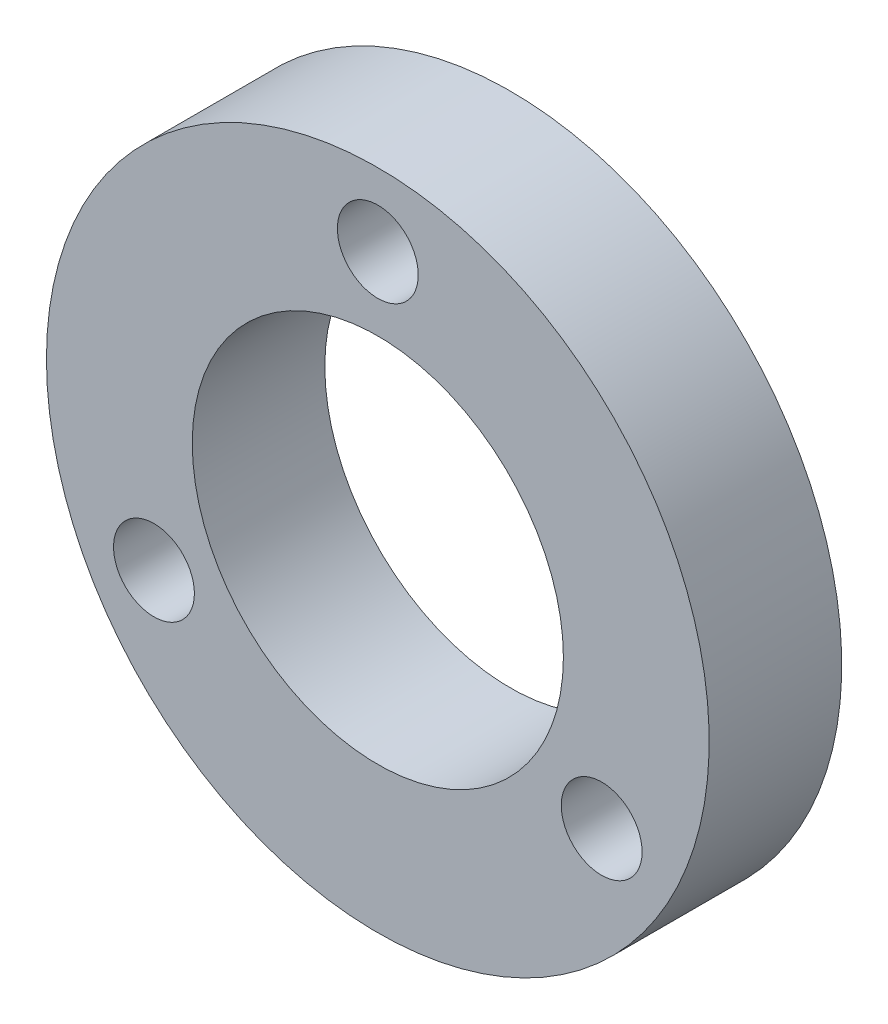
ISO-10303-21;
HEADER;
FILE_DESCRIPTION(('STEP AP214'),'2;1');
FILE_NAME('part.step','',(''),(''),'','','');
FILE_SCHEMA(('AUTOMOTIVE_DESIGN { 1 0 10303 214 1 1 1 1 }'));
ENDSEC;
DATA;
#1=APPLICATION_CONTEXT('core data for automotive mechanical design processes');
#2=APPLICATION_PROTOCOL_DEFINITION('international standard','automotive_design',2000,#1);
#3=PRODUCT_CONTEXT('',#1,'mechanical');
#4=PRODUCT('Part','Part','',(#3));
#5=PRODUCT_RELATED_PRODUCT_CATEGORY('part','',(#4));
#6=PRODUCT_DEFINITION_FORMATION('','',#4);
#7=PRODUCT_DEFINITION_CONTEXT('part definition',#1,'design');
#8=PRODUCT_DEFINITION('design','',#6,#7);
#9=PRODUCT_DEFINITION_SHAPE('','',#8);
#10=(LENGTH_UNIT() NAMED_UNIT(*) SI_UNIT(.MILLI.,.METRE.));
#11=(NAMED_UNIT(*) PLANE_ANGLE_UNIT() SI_UNIT($,.RADIAN.));
#12=(NAMED_UNIT(*) SI_UNIT($,.STERADIAN.) SOLID_ANGLE_UNIT());
#13=UNCERTAINTY_MEASURE_WITH_UNIT(LENGTH_MEASURE(1.E-05),#10,'distance_accuracy_value','');
#14=(GEOMETRIC_REPRESENTATION_CONTEXT(3) GLOBAL_UNCERTAINTY_ASSIGNED_CONTEXT((#13)) GLOBAL_UNIT_ASSIGNED_CONTEXT((#10,
#11,#12)) REPRESENTATION_CONTEXT('',''));
#15=CARTESIAN_POINT('',(0.,0.,0.));
#16=DIRECTION('',(0.,0.,1.));
#17=DIRECTION('',(1.,0.,0.));
#18=AXIS2_PLACEMENT_3D('',#15,#16,#17);
#19=CARTESIAN_POINT('',(0.,0.,5.));
#20=DIRECTION('',(0.,0.,0.999999999999999));
#21=DIRECTION('',(1.,0.,0.));
#22=AXIS2_PLACEMENT_3D('',#19,#20,#21);
#23=PLANE('',#22);
#24=CARTESIAN_POINT('',(0.,9.74999999999993,5.));
#25=DIRECTION('',(0.,0.,0.999999999999999));
#26=DIRECTION('',(1.,0.,0.));
#27=AXIS2_PLACEMENT_3D('',#24,#25,#26);
#28=CIRCLE('',#27,1.525);
#29=CARTESIAN_POINT('',(1.52500000000011,9.74999999999993,5.00000000000001));
#30=VERTEX_POINT('',#29);
#31=EDGE_CURVE('E59',#30,#30,#28,.T.);
#32=ORIENTED_EDGE('',*,*,#31,.F.);
#33=EDGE_LOOP('',(#32));
#34=FACE_BOUND('',#33,.T.);
#35=CARTESIAN_POINT('',(8.44374768689865,-4.87499999999986,5.00000000000012));
#36=DIRECTION('',(0.,0.,0.999999999999999));
#37=DIRECTION('',(1.,0.,0.));
#38=AXIS2_PLACEMENT_3D('',#35,#36,#37);
#39=CIRCLE('',#38,1.52500000000053);
#40=CARTESIAN_POINT('',(9.9687476868993,-4.87499999999985,5.00000000000012));
#41=VERTEX_POINT('',#40);
#42=EDGE_CURVE('E52',#41,#41,#39,.T.);
#43=ORIENTED_EDGE('',*,*,#42,.F.);
#44=EDGE_LOOP('',(#43));
#45=FACE_BOUND('',#44,.T.);
#46=CARTESIAN_POINT('',(-8.44374768689776,-4.8750000000004,5.00000000000006));
#47=DIRECTION('',(0.,0.,0.999999999999999));
#48=DIRECTION('',(1.,0.,0.));
#49=AXIS2_PLACEMENT_3D('',#46,#47,#48);
#50=CIRCLE('',#49,1.52500000000079);
#51=CARTESIAN_POINT('',(-6.91874768689692,-4.87500000000041,5.00000000000006));
#52=VERTEX_POINT('',#51);
#53=EDGE_CURVE('E53',#52,#52,#50,.T.);
#54=ORIENTED_EDGE('',*,*,#53,.F.);
#55=EDGE_LOOP('',(#54));
#56=FACE_BOUND('',#55,.T.);
#57=CARTESIAN_POINT('',(0.,0.,5.));
#58=DIRECTION('',(0.,0.,0.999999999999999));
#59=DIRECTION('',(1.,0.,0.));
#60=AXIS2_PLACEMENT_3D('',#57,#58,#59);
#61=CIRCLE('',#60,12.5);
#62=CARTESIAN_POINT('',(-12.5,0.,5.));
#63=VERTEX_POINT('',#62);
#64=EDGE_CURVE('E10',#63,#63,#61,.T.);
#65=ORIENTED_EDGE('',*,*,#64,.T.);
#66=EDGE_LOOP('',(#65));
#67=FACE_BOUND('',#66,.T.);
#68=CARTESIAN_POINT('',(0.,0.,5.));
#69=DIRECTION('',(0.,0.,0.999999999999999));
#70=DIRECTION('',(1.,0.,0.));
#71=AXIS2_PLACEMENT_3D('',#68,#69,#70);
#72=CIRCLE('',#71,7.);
#73=CARTESIAN_POINT('',(-7.00000000000001,0.,5.));
#74=VERTEX_POINT('',#73);
#75=EDGE_CURVE('E41',#74,#74,#72,.T.);
#76=ORIENTED_EDGE('',*,*,#75,.F.);
#77=EDGE_LOOP('',(#76));
#78=FACE_BOUND('',#77,.T.);
#79=ADVANCED_FACE('F30',(#34,#45,#56,#67,#78),#23,.T.);
#80=CARTESIAN_POINT('',(0.,0.,0.));
#81=DIRECTION('',(0.,0.,0.999999999999999));
#82=DIRECTION('',(1.,0.,0.));
#83=AXIS2_PLACEMENT_3D('',#80,#81,#82);
#84=PLANE('',#83);
#85=CARTESIAN_POINT('',(1.11022302462516E-13,9.74999999999993,0.));
#86=DIRECTION('',(0.,0.,0.999999999999999));
#87=DIRECTION('',(1.,0.,0.));
#88=AXIS2_PLACEMENT_3D('',#85,#86,#87);
#89=CIRCLE('',#88,1.525);
#90=CARTESIAN_POINT('',(1.52500000000011,9.74999999999993,0.));
#91=VERTEX_POINT('',#90);
#92=EDGE_CURVE('E46',#91,#91,#89,.F.);
#93=ORIENTED_EDGE('',*,*,#92,.F.);
#94=EDGE_LOOP('',(#93));
#95=FACE_BOUND('',#94,.T.);
#96=CARTESIAN_POINT('',(8.44374768689876,-4.87499999999985,1.11022302462516E-13));
#97=DIRECTION('',(0.,0.,0.999999999999999));
#98=DIRECTION('',(1.,0.,0.));
#99=AXIS2_PLACEMENT_3D('',#96,#97,#98);
#100=CIRCLE('',#99,1.52500000000053);
#101=CARTESIAN_POINT('',(9.9687476868993,-4.87499999999985,1.11022302462516E-13));
#102=VERTEX_POINT('',#101);
#103=EDGE_CURVE('E56',#102,#102,#100,.F.);
#104=ORIENTED_EDGE('',*,*,#103,.F.);
#105=EDGE_LOOP('',(#104));
#106=FACE_BOUND('',#105,.T.);
#107=CARTESIAN_POINT('',(-8.44374768689771,-4.87500000000041,1.11022302462516E-13));
#108=DIRECTION('',(0.,0.,0.999999999999999));
#109=DIRECTION('',(1.,0.,0.));
#110=AXIS2_PLACEMENT_3D('',#107,#108,#109);
#111=CIRCLE('',#110,1.52500000000079);
#112=CARTESIAN_POINT('',(-6.91874768689692,-4.87500000000041,1.11022302462516E-13));
#113=VERTEX_POINT('',#112);
#114=EDGE_CURVE('E49',#113,#113,#111,.F.);
#115=ORIENTED_EDGE('',*,*,#114,.F.);
#116=EDGE_LOOP('',(#115));
#117=FACE_BOUND('',#116,.T.);
#118=CARTESIAN_POINT('',(0.,0.,0.));
#119=DIRECTION('',(0.,0.,0.999999999999999));
#120=DIRECTION('',(1.,0.,0.));
#121=AXIS2_PLACEMENT_3D('',#118,#119,#120);
#122=CIRCLE('',#121,12.5);
#123=CARTESIAN_POINT('',(-12.5,0.,0.));
#124=VERTEX_POINT('',#123);
#125=EDGE_CURVE('E34',#124,#124,#122,.T.);
#126=ORIENTED_EDGE('',*,*,#125,.F.);
#127=EDGE_LOOP('',(#126));
#128=FACE_BOUND('',#127,.T.);
#129=CARTESIAN_POINT('',(0.,0.,0.));
#130=DIRECTION('',(0.,0.,0.999999999999999));
#131=DIRECTION('',(1.,0.,0.));
#132=AXIS2_PLACEMENT_3D('',#129,#130,#131);
#133=CIRCLE('',#132,7.);
#134=CARTESIAN_POINT('',(-7.00000000000001,0.,0.));
#135=VERTEX_POINT('',#134);
#136=EDGE_CURVE('E43',#135,#135,#133,.T.);
#137=ORIENTED_EDGE('',*,*,#136,.T.);
#138=EDGE_LOOP('',(#137));
#139=FACE_BOUND('',#138,.T.);
#140=ADVANCED_FACE('F72',(#95,#106,#117,#128,#139),#84,.F.);
#141=CARTESIAN_POINT('',(0.,0.,5.));
#142=DIRECTION('',(0.,0.,-0.999999999999999));
#143=DIRECTION('',(-1.,0.,0.));
#144=AXIS2_PLACEMENT_3D('',#141,#142,#143);
#145=CYLINDRICAL_SURFACE('',#144,12.5);
#146=CARTESIAN_POINT('',(-12.5,0.,5.));
#147=CARTESIAN_POINT('',(-12.5,0.,4.94791666666667));
#148=CARTESIAN_POINT('',(-12.5,0.,4.89583333333334));
#149=CARTESIAN_POINT('',(-12.5,0.,4.79166666666667));
#150=CARTESIAN_POINT('',(-12.5,0.,4.73958333333334));
#151=CARTESIAN_POINT('',(-12.5,0.,4.63541666666667));
#152=CARTESIAN_POINT('',(-12.5,0.,4.58333333333334));
#153=CARTESIAN_POINT('',(-12.5,0.,4.47916666666667));
#154=CARTESIAN_POINT('',(-12.5,0.,4.42708333333334));
#155=CARTESIAN_POINT('',(-12.5,0.,4.32291666666667));
#156=CARTESIAN_POINT('',(-12.5,0.,4.27083333333334));
#157=CARTESIAN_POINT('',(-12.5,0.,4.16666666666667));
#158=CARTESIAN_POINT('',(-12.5,0.,4.11458333333334));
#159=CARTESIAN_POINT('',(-12.5,0.,4.01041666666667));
#160=CARTESIAN_POINT('',(-12.5,0.,3.95833333333334));
#161=CARTESIAN_POINT('',(-12.5,0.,3.85416666666667));
#162=CARTESIAN_POINT('',(-12.5,0.,3.80208333333334));
#163=CARTESIAN_POINT('',(-12.5,0.,3.69791666666667));
#164=CARTESIAN_POINT('',(-12.5,0.,3.64583333333334));
#165=CARTESIAN_POINT('',(-12.5,0.,3.54166666666667));
#166=CARTESIAN_POINT('',(-12.5,0.,3.48958333333334));
#167=CARTESIAN_POINT('',(-12.5,0.,3.38541666666667));
#168=CARTESIAN_POINT('',(-12.5,0.,3.33333333333334));
#169=CARTESIAN_POINT('',(-12.5,0.,3.22916666666667));
#170=CARTESIAN_POINT('',(-12.5,0.,3.17708333333334));
#171=CARTESIAN_POINT('',(-12.5,0.,3.07291666666667));
#172=CARTESIAN_POINT('',(-12.5,0.,3.02083333333333));
#173=CARTESIAN_POINT('',(-12.5,0.,2.91666666666667));
#174=CARTESIAN_POINT('',(-12.5,0.,2.86458333333333));
#175=CARTESIAN_POINT('',(-12.5,0.,2.76041666666667));
#176=CARTESIAN_POINT('',(-12.5,0.,2.70833333333333));
#177=CARTESIAN_POINT('',(-12.5,0.,2.60416666666667));
#178=CARTESIAN_POINT('',(-12.5,0.,2.55208333333333));
#179=CARTESIAN_POINT('',(-12.5,0.,2.44791666666667));
#180=CARTESIAN_POINT('',(-12.5,0.,2.39583333333333));
#181=CARTESIAN_POINT('',(-12.5,0.,2.29166666666667));
#182=CARTESIAN_POINT('',(-12.5,0.,2.23958333333333));
#183=CARTESIAN_POINT('',(-12.5,0.,2.13541666666667));
#184=CARTESIAN_POINT('',(-12.5,0.,2.08333333333333));
#185=CARTESIAN_POINT('',(-12.5,0.,1.97916666666667));
#186=CARTESIAN_POINT('',(-12.5,0.,1.92708333333333));
#187=CARTESIAN_POINT('',(-12.5,0.,1.82291666666667));
#188=CARTESIAN_POINT('',(-12.5,0.,1.77083333333333));
#189=CARTESIAN_POINT('',(-12.5,0.,1.66666666666667));
#190=CARTESIAN_POINT('',(-12.5,0.,1.61458333333333));
#191=CARTESIAN_POINT('',(-12.5,0.,1.51041666666667));
#192=CARTESIAN_POINT('',(-12.5,0.,1.45833333333333));
#193=CARTESIAN_POINT('',(-12.5,0.,1.35416666666667));
#194=CARTESIAN_POINT('',(-12.5,0.,1.30208333333333));
#195=CARTESIAN_POINT('',(-12.5,0.,1.19791666666667));
#196=CARTESIAN_POINT('',(-12.5,0.,1.14583333333333));
#197=CARTESIAN_POINT('',(-12.5,0.,1.04166666666667));
#198=CARTESIAN_POINT('',(-12.5,0.,0.989583333333333));
#199=CARTESIAN_POINT('',(-12.5,0.,0.885416666666667));
#200=CARTESIAN_POINT('',(-12.5,0.,0.833333333333333));
#201=CARTESIAN_POINT('',(-12.5,0.,0.729166666666667));
#202=CARTESIAN_POINT('',(-12.5,0.,0.677083333333333));
#203=CARTESIAN_POINT('',(-12.5,0.,0.572916666666667));
#204=CARTESIAN_POINT('',(-12.5,0.,0.520833333333334));
#205=CARTESIAN_POINT('',(-12.5,0.,0.416666666666667));
#206=CARTESIAN_POINT('',(-12.5,0.,0.364583333333333));
#207=CARTESIAN_POINT('',(-12.5,0.,0.260416666666666));
#208=CARTESIAN_POINT('',(-12.5,0.,0.208333333333333));
#209=CARTESIAN_POINT('',(-12.5,0.,0.104166666666666));
#210=CARTESIAN_POINT('',(-12.5,0.,0.0520833333333324));
#211=CARTESIAN_POINT('',(-12.5,0.,0.));
#212=B_SPLINE_CURVE_WITH_KNOTS('',3,(#146,#147,#148,#149,#150,#151,#152,#153,#154,#155,#156,
#157,#158,#159,#160,#161,#162,#163,#164,#165,#166,#167,#168,#169,#170,#171,#172,#173,#174,#175,
#176,#177,#178,#179,#180,#181,#182,#183,#184,#185,#186,#187,#188,#189,#190,#191,#192,#193,#194,
#195,#196,#197,#198,#199,#200,#201,#202,#203,#204,#205,#206,#207,#208,#209,#210,#211),
.UNSPECIFIED.,.F.,.F.,(4,2,2,2,2,2,2,2,2,2,2,2,2,2,2,2,2,2,2,2,2,2,2,2,2,2,2,2,2,2,2,2,4),(0.,
0.156250000000001,0.312500000000001,0.468750000000001,0.625000000000001,0.781250000000002,
0.937500000000002,1.09375,1.25,1.40625,1.5625,1.71875,1.875,2.03125,2.1875,2.34375,2.5,2.65625,
2.8125,2.96875,3.125,3.28125,3.4375,3.59375,3.75,3.90625,4.0625,4.21875,4.375,4.53125,
4.68750000000001,4.84375000000001,5.00000000000001),.UNSPECIFIED.);
#213=EDGE_CURVE('BSEAM32',#63,#124,#212,.T.);
#214=ORIENTED_EDGE('',*,*,#64,.F.);
#215=ORIENTED_EDGE('',*,*,#125,.T.);
#216=ORIENTED_EDGE('',*,*,#213,.T.);
#217=ORIENTED_EDGE('',*,*,#213,.F.);
#218=EDGE_LOOP('',(#214,#216,#215,#217));
#219=FACE_BOUND('',#218,.T.);
#220=ADVANCED_FACE('F32',(#219),#145,.T.);
#221=CARTESIAN_POINT('',(0.,0.,5.));
#222=DIRECTION('',(0.,0.,-0.999999999999999));
#223=DIRECTION('',(-1.,0.,0.));
#224=AXIS2_PLACEMENT_3D('',#221,#222,#223);
#225=CYLINDRICAL_SURFACE('',#224,7.);
#226=CARTESIAN_POINT('',(-7.00000000000001,0.,5.));
#227=CARTESIAN_POINT('',(-7.00000000000001,0.,4.94791666666667));
#228=CARTESIAN_POINT('',(-7.00000000000001,0.,4.89583333333334));
#229=CARTESIAN_POINT('',(-7.00000000000001,0.,4.79166666666667));
#230=CARTESIAN_POINT('',(-7.00000000000001,0.,4.73958333333334));
#231=CARTESIAN_POINT('',(-7.00000000000001,0.,4.63541666666667));
#232=CARTESIAN_POINT('',(-7.00000000000001,0.,4.58333333333334));
#233=CARTESIAN_POINT('',(-7.00000000000001,0.,4.47916666666667));
#234=CARTESIAN_POINT('',(-7.00000000000001,0.,4.42708333333334));
#235=CARTESIAN_POINT('',(-7.00000000000001,0.,4.32291666666667));
#236=CARTESIAN_POINT('',(-7.00000000000001,0.,4.27083333333334));
#237=CARTESIAN_POINT('',(-7.00000000000001,0.,4.16666666666667));
#238=CARTESIAN_POINT('',(-7.00000000000001,0.,4.11458333333334));
#239=CARTESIAN_POINT('',(-7.00000000000001,0.,4.01041666666667));
#240=CARTESIAN_POINT('',(-7.00000000000001,0.,3.95833333333334));
#241=CARTESIAN_POINT('',(-7.00000000000001,0.,3.85416666666667));
#242=CARTESIAN_POINT('',(-7.00000000000001,0.,3.80208333333334));
#243=CARTESIAN_POINT('',(-7.00000000000001,0.,3.69791666666667));
#244=CARTESIAN_POINT('',(-7.00000000000001,0.,3.64583333333334));
#245=CARTESIAN_POINT('',(-7.00000000000001,0.,3.54166666666667));
#246=CARTESIAN_POINT('',(-7.00000000000001,0.,3.48958333333334));
#247=CARTESIAN_POINT('',(-7.00000000000001,0.,3.38541666666667));
#248=CARTESIAN_POINT('',(-7.00000000000001,0.,3.33333333333334));
#249=CARTESIAN_POINT('',(-7.00000000000001,0.,3.22916666666667));
#250=CARTESIAN_POINT('',(-7.00000000000001,0.,3.17708333333334));
#251=CARTESIAN_POINT('',(-7.00000000000001,0.,3.07291666666667));
#252=CARTESIAN_POINT('',(-7.00000000000001,0.,3.02083333333333));
#253=CARTESIAN_POINT('',(-7.00000000000001,0.,2.91666666666667));
#254=CARTESIAN_POINT('',(-7.00000000000001,0.,2.86458333333333));
#255=CARTESIAN_POINT('',(-7.00000000000001,0.,2.76041666666667));
#256=CARTESIAN_POINT('',(-7.00000000000001,0.,2.70833333333333));
#257=CARTESIAN_POINT('',(-7.00000000000001,0.,2.60416666666667));
#258=CARTESIAN_POINT('',(-7.00000000000001,0.,2.55208333333333));
#259=CARTESIAN_POINT('',(-7.00000000000001,0.,2.44791666666667));
#260=CARTESIAN_POINT('',(-7.00000000000001,0.,2.39583333333333));
#261=CARTESIAN_POINT('',(-7.00000000000001,0.,2.29166666666667));
#262=CARTESIAN_POINT('',(-7.00000000000001,0.,2.23958333333333));
#263=CARTESIAN_POINT('',(-7.00000000000001,0.,2.13541666666667));
#264=CARTESIAN_POINT('',(-7.00000000000001,0.,2.08333333333333));
#265=CARTESIAN_POINT('',(-7.00000000000001,0.,1.97916666666667));
#266=CARTESIAN_POINT('',(-7.00000000000001,0.,1.92708333333333));
#267=CARTESIAN_POINT('',(-7.00000000000001,0.,1.82291666666667));
#268=CARTESIAN_POINT('',(-7.00000000000001,0.,1.77083333333333));
#269=CARTESIAN_POINT('',(-7.00000000000001,0.,1.66666666666667));
#270=CARTESIAN_POINT('',(-7.00000000000001,0.,1.61458333333333));
#271=CARTESIAN_POINT('',(-7.00000000000001,0.,1.51041666666667));
#272=CARTESIAN_POINT('',(-7.00000000000001,0.,1.45833333333333));
#273=CARTESIAN_POINT('',(-7.00000000000001,0.,1.35416666666667));
#274=CARTESIAN_POINT('',(-7.00000000000001,0.,1.30208333333333));
#275=CARTESIAN_POINT('',(-7.00000000000001,0.,1.19791666666667));
#276=CARTESIAN_POINT('',(-7.00000000000001,0.,1.14583333333333));
#277=CARTESIAN_POINT('',(-7.00000000000001,0.,1.04166666666667));
#278=CARTESIAN_POINT('',(-7.00000000000001,0.,0.989583333333333));
#279=CARTESIAN_POINT('',(-7.00000000000001,0.,0.885416666666667));
#280=CARTESIAN_POINT('',(-7.00000000000001,0.,0.833333333333333));
#281=CARTESIAN_POINT('',(-7.00000000000001,0.,0.729166666666667));
#282=CARTESIAN_POINT('',(-7.00000000000001,0.,0.677083333333333));
#283=CARTESIAN_POINT('',(-7.00000000000001,0.,0.572916666666667));
#284=CARTESIAN_POINT('',(-7.00000000000001,0.,0.520833333333334));
#285=CARTESIAN_POINT('',(-7.00000000000001,0.,0.416666666666667));
#286=CARTESIAN_POINT('',(-7.00000000000001,0.,0.364583333333333));
#287=CARTESIAN_POINT('',(-7.00000000000001,0.,0.260416666666666));
#288=CARTESIAN_POINT('',(-7.00000000000001,0.,0.208333333333333));
#289=CARTESIAN_POINT('',(-7.00000000000001,0.,0.104166666666666));
#290=CARTESIAN_POINT('',(-7.00000000000001,0.,0.0520833333333324));
#291=CARTESIAN_POINT('',(-7.00000000000001,0.,0.));
#292=B_SPLINE_CURVE_WITH_KNOTS('',3,(#226,#227,#228,#229,#230,#231,#232,#233,#234,#235,#236,
#237,#238,#239,#240,#241,#242,#243,#244,#245,#246,#247,#248,#249,#250,#251,#252,#253,#254,#255,
#256,#257,#258,#259,#260,#261,#262,#263,#264,#265,#266,#267,#268,#269,#270,#271,#272,#273,#274,
#275,#276,#277,#278,#279,#280,#281,#282,#283,#284,#285,#286,#287,#288,#289,#290,#291),
.UNSPECIFIED.,.F.,.F.,(4,2,2,2,2,2,2,2,2,2,2,2,2,2,2,2,2,2,2,2,2,2,2,2,2,2,2,2,2,2,2,2,4),(0.,
0.156250000000001,0.312500000000001,0.468750000000001,0.625000000000001,0.781250000000002,
0.937500000000002,1.09375,1.25,1.40625,1.5625,1.71875,1.875,2.03125,2.1875,2.34375,2.5,2.65625,
2.8125,2.96875,3.125,3.28125,3.4375,3.59375,3.75,3.90625,4.0625,4.21875,4.375,4.53125,
4.68750000000001,4.84375000000001,5.00000000000001),.UNSPECIFIED.);
#293=EDGE_CURVE('BSEAM80',#74,#135,#292,.T.);
#294=ORIENTED_EDGE('',*,*,#75,.T.);
#295=ORIENTED_EDGE('',*,*,#136,.F.);
#296=ORIENTED_EDGE('',*,*,#293,.T.);
#297=ORIENTED_EDGE('',*,*,#293,.F.);
#298=EDGE_LOOP('',(#294,#296,#295,#297));
#299=FACE_BOUND('',#298,.T.);
#300=ADVANCED_FACE('F80',(#299),#225,.F.);
#301=CARTESIAN_POINT('',(-8.44374768689771,-4.87500000000041,-0.000999999999917733));
#302=DIRECTION('',(0.,0.,0.999999999999999));
#303=DIRECTION('',(1.,0.,0.));
#304=AXIS2_PLACEMENT_3D('',#301,#302,#303);
#305=CYLINDRICAL_SURFACE('',#304,1.52500000000079);
#306=CARTESIAN_POINT('',(-6.91874768689692,-4.87500000000041,5.00000000000006));
#307=CARTESIAN_POINT('',(-6.91874768689692,-4.87500000000041,4.94791666666673));
#308=CARTESIAN_POINT('',(-6.91874768689692,-4.87500000000041,4.8958333333334));
#309=CARTESIAN_POINT('',(-6.91874768689692,-4.87500000000041,4.79166666666673));
#310=CARTESIAN_POINT('',(-6.91874768689692,-4.87500000000041,4.7395833333334));
#311=CARTESIAN_POINT('',(-6.91874768689692,-4.87500000000041,4.63541666666673));
#312=CARTESIAN_POINT('',(-6.91874768689692,-4.87500000000041,4.5833333333334));
#313=CARTESIAN_POINT('',(-6.91874768689692,-4.87500000000041,4.47916666666673));
#314=CARTESIAN_POINT('',(-6.91874768689692,-4.87500000000041,4.4270833333334));
#315=CARTESIAN_POINT('',(-6.91874768689692,-4.87500000000041,4.32291666666673));
#316=CARTESIAN_POINT('',(-6.91874768689692,-4.87500000000041,4.2708333333334));
#317=CARTESIAN_POINT('',(-6.91874768689692,-4.87500000000041,4.16666666666674));
#318=CARTESIAN_POINT('',(-6.91874768689692,-4.87500000000041,4.1145833333334));
#319=CARTESIAN_POINT('',(-6.91874768689692,-4.87500000000041,4.01041666666674));
#320=CARTESIAN_POINT('',(-6.91874768689692,-4.87500000000041,3.9583333333334));
#321=CARTESIAN_POINT('',(-6.91874768689692,-4.87500000000041,3.85416666666674));
#322=CARTESIAN_POINT('',(-6.91874768689692,-4.87500000000041,3.80208333333341));
#323=CARTESIAN_POINT('',(-6.91874768689692,-4.87500000000041,3.69791666666674));
#324=CARTESIAN_POINT('',(-6.91874768689692,-4.87500000000041,3.64583333333341));
#325=CARTESIAN_POINT('',(-6.91874768689692,-4.87500000000041,3.54166666666674));
#326=CARTESIAN_POINT('',(-6.91874768689692,-4.87500000000041,3.48958333333341));
#327=CARTESIAN_POINT('',(-6.91874768689692,-4.87500000000041,3.38541666666674));
#328=CARTESIAN_POINT('',(-6.91874768689692,-4.87500000000041,3.33333333333341));
#329=CARTESIAN_POINT('',(-6.91874768689692,-4.87500000000041,3.22916666666675));
#330=CARTESIAN_POINT('',(-6.91874768689692,-4.87500000000041,3.17708333333341));
#331=CARTESIAN_POINT('',(-6.91874768689692,-4.87500000000041,3.07291666666675));
#332=CARTESIAN_POINT('',(-6.91874768689692,-4.87500000000041,3.02083333333341));
#333=CARTESIAN_POINT('',(-6.91874768689692,-4.87500000000041,2.91666666666675));
#334=CARTESIAN_POINT('',(-6.91874768689692,-4.87500000000041,2.86458333333342));
#335=CARTESIAN_POINT('',(-6.91874768689692,-4.87500000000041,2.76041666666675));
#336=CARTESIAN_POINT('',(-6.91874768689692,-4.87500000000041,2.70833333333342));
#337=CARTESIAN_POINT('',(-6.91874768689692,-4.87500000000041,2.60416666666675));
#338=CARTESIAN_POINT('',(-6.91874768689692,-4.87500000000041,2.55208333333342));
#339=CARTESIAN_POINT('',(-6.91874768689692,-4.87500000000041,2.44791666666675));
#340=CARTESIAN_POINT('',(-6.91874768689692,-4.87500000000041,2.39583333333342));
#341=CARTESIAN_POINT('',(-6.91874768689692,-4.87500000000041,2.29166666666675));
#342=CARTESIAN_POINT('',(-6.91874768689692,-4.87500000000041,2.23958333333342));
#343=CARTESIAN_POINT('',(-6.91874768689692,-4.87500000000041,2.13541666666676));
#344=CARTESIAN_POINT('',(-6.91874768689692,-4.87500000000041,2.08333333333342));
#345=CARTESIAN_POINT('',(-6.91874768689692,-4.87500000000041,1.97916666666676));
#346=CARTESIAN_POINT('',(-6.91874768689692,-4.87500000000041,1.92708333333342));
#347=CARTESIAN_POINT('',(-6.91874768689692,-4.87500000000041,1.82291666666676));
#348=CARTESIAN_POINT('',(-6.91874768689692,-4.87500000000041,1.77083333333343));
#349=CARTESIAN_POINT('',(-6.91874768689692,-4.87500000000041,1.66666666666676));
#350=CARTESIAN_POINT('',(-6.91874768689692,-4.87500000000041,1.61458333333343));
#351=CARTESIAN_POINT('',(-6.91874768689692,-4.87500000000041,1.51041666666676));
#352=CARTESIAN_POINT('',(-6.91874768689692,-4.87500000000041,1.45833333333343));
#353=CARTESIAN_POINT('',(-6.91874768689692,-4.87500000000041,1.35416666666676));
#354=CARTESIAN_POINT('',(-6.91874768689692,-4.87500000000041,1.30208333333343));
#355=CARTESIAN_POINT('',(-6.91874768689692,-4.87500000000041,1.19791666666677));
#356=CARTESIAN_POINT('',(-6.91874768689692,-4.87500000000041,1.14583333333343));
#357=CARTESIAN_POINT('',(-6.91874768689692,-4.87500000000041,1.04166666666677));
#358=CARTESIAN_POINT('',(-6.91874768689692,-4.87500000000041,0.989583333333435));
#359=CARTESIAN_POINT('',(-6.91874768689692,-4.87500000000041,0.885416666666769));
#360=CARTESIAN_POINT('',(-6.91874768689692,-4.87500000000041,0.833333333333436));
#361=CARTESIAN_POINT('',(-6.91874768689692,-4.87500000000041,0.72916666666677));
#362=CARTESIAN_POINT('',(-6.91874768689692,-4.87500000000041,0.677083333333438));
#363=CARTESIAN_POINT('',(-6.91874768689692,-4.87500000000041,0.572916666666772));
#364=CARTESIAN_POINT('',(-6.91874768689692,-4.87500000000041,0.52083333333344));
#365=CARTESIAN_POINT('',(-6.91874768689692,-4.87500000000041,0.416666666666774));
#366=CARTESIAN_POINT('',(-6.91874768689692,-4.87500000000041,0.364583333333441));
#367=CARTESIAN_POINT('',(-6.91874768689692,-4.87500000000041,0.260416666666775));
#368=CARTESIAN_POINT('',(-6.91874768689692,-4.87500000000041,0.208333333333442));
#369=CARTESIAN_POINT('',(-6.91874768689692,-4.87500000000041,0.104166666666777));
#370=CARTESIAN_POINT('',(-6.91874768689692,-4.87500000000041,0.0520833333334438));
#371=CARTESIAN_POINT('',(-6.91874768689692,-4.87500000000041,1.11021455429568E-13));
#372=B_SPLINE_CURVE_WITH_KNOTS('',3,(#306,#307,#308,#309,#310,#311,#312,#313,#314,#315,#316,
#317,#318,#319,#320,#321,#322,#323,#324,#325,#326,#327,#328,#329,#330,#331,#332,#333,#334,#335,
#336,#337,#338,#339,#340,#341,#342,#343,#344,#345,#346,#347,#348,#349,#350,#351,#352,#353,#354,
#355,#356,#357,#358,#359,#360,#361,#362,#363,#364,#365,#366,#367,#368,#369,#370,#371),
.UNSPECIFIED.,.F.,.F.,(4,2,2,2,2,2,2,2,2,2,2,2,2,2,2,2,2,2,2,2,2,2,2,2,2,2,2,2,2,2,2,2,4),(0.,
0.156249999999998,0.312499999999997,0.468749999999996,0.624999999999994,0.781249999999992,
0.93749999999999,1.09374999999999,1.24999999999999,1.40624999999999,1.56249999999998,
1.71874999999998,1.87499999999998,2.03124999999998,2.18749999999998,2.34374999999998,
2.49999999999997,2.65624999999997,2.81249999999997,2.96874999999997,3.12499999999997,
3.28124999999997,3.43749999999997,3.59374999999996,3.74999999999996,3.90624999999996,
4.06249999999996,4.21874999999996,4.37499999999996,4.53124999999996,4.68749999999995,
4.84374999999995,4.99999999999995),.UNSPECIFIED.);
#373=EDGE_CURVE('BSEAM83',#52,#113,#372,.T.);
#374=ORIENTED_EDGE('',*,*,#53,.T.);
#375=ORIENTED_EDGE('',*,*,#114,.T.);
#376=ORIENTED_EDGE('',*,*,#373,.T.);
#377=ORIENTED_EDGE('',*,*,#373,.F.);
#378=EDGE_LOOP('',(#374,#376,#375,#377));
#379=FACE_BOUND('',#378,.T.);
#380=ADVANCED_FACE('F83',(#379),#305,.F.);
#381=CARTESIAN_POINT('',(8.44374768689876,-4.87499999999985,-0.000999999999917733));
#382=DIRECTION('',(0.,0.,0.999999999999999));
#383=DIRECTION('',(1.,0.,0.));
#384=AXIS2_PLACEMENT_3D('',#381,#382,#383);
#385=CYLINDRICAL_SURFACE('',#384,1.52500000000053);
#386=CARTESIAN_POINT('',(9.9687476868993,-4.87499999999985,5.00000000000012));
#387=CARTESIAN_POINT('',(9.9687476868993,-4.87499999999985,4.94791666666678));
#388=CARTESIAN_POINT('',(9.9687476868993,-4.87499999999985,4.89583333333345));
#389=CARTESIAN_POINT('',(9.9687476868993,-4.87499999999985,4.79166666666678));
#390=CARTESIAN_POINT('',(9.9687476868993,-4.87499999999985,4.73958333333345));
#391=CARTESIAN_POINT('',(9.9687476868993,-4.87499999999985,4.63541666666678));
#392=CARTESIAN_POINT('',(9.9687476868993,-4.87499999999985,4.58333333333345));
#393=CARTESIAN_POINT('',(9.9687476868993,-4.87499999999985,4.47916666666678));
#394=CARTESIAN_POINT('',(9.9687476868993,-4.87499999999985,4.42708333333345));
#395=CARTESIAN_POINT('',(9.9687476868993,-4.87499999999985,4.32291666666678));
#396=CARTESIAN_POINT('',(9.9687476868993,-4.87499999999985,4.27083333333345));
#397=CARTESIAN_POINT('',(9.9687476868993,-4.87499999999985,4.16666666666678));
#398=CARTESIAN_POINT('',(9.9687476868993,-4.87499999999985,4.11458333333345));
#399=CARTESIAN_POINT('',(9.9687476868993,-4.87499999999985,4.01041666666678));
#400=CARTESIAN_POINT('',(9.9687476868993,-4.87499999999985,3.95833333333345));
#401=CARTESIAN_POINT('',(9.9687476868993,-4.87499999999985,3.85416666666678));
#402=CARTESIAN_POINT('',(9.9687476868993,-4.87499999999985,3.80208333333345));
#403=CARTESIAN_POINT('',(9.9687476868993,-4.87499999999985,3.69791666666678));
#404=CARTESIAN_POINT('',(9.9687476868993,-4.87499999999985,3.64583333333345));
#405=CARTESIAN_POINT('',(9.9687476868993,-4.87499999999985,3.54166666666678));
#406=CARTESIAN_POINT('',(9.9687476868993,-4.87499999999985,3.48958333333345));
#407=CARTESIAN_POINT('',(9.9687476868993,-4.87499999999985,3.38541666666678));
#408=CARTESIAN_POINT('',(9.9687476868993,-4.87499999999985,3.33333333333345));
#409=CARTESIAN_POINT('',(9.9687476868993,-4.87499999999985,3.22916666666678));
#410=CARTESIAN_POINT('',(9.9687476868993,-4.87499999999985,3.17708333333345));
#411=CARTESIAN_POINT('',(9.9687476868993,-4.87499999999985,3.07291666666678));
#412=CARTESIAN_POINT('',(9.9687476868993,-4.87499999999985,3.02083333333345));
#413=CARTESIAN_POINT('',(9.9687476868993,-4.87499999999985,2.91666666666678));
#414=CARTESIAN_POINT('',(9.9687476868993,-4.87499999999985,2.86458333333345));
#415=CARTESIAN_POINT('',(9.9687476868993,-4.87499999999985,2.76041666666678));
#416=CARTESIAN_POINT('',(9.9687476868993,-4.87499999999985,2.70833333333345));
#417=CARTESIAN_POINT('',(9.9687476868993,-4.87499999999985,2.60416666666678));
#418=CARTESIAN_POINT('',(9.9687476868993,-4.87499999999985,2.55208333333345));
#419=CARTESIAN_POINT('',(9.9687476868993,-4.87499999999985,2.44791666666678));
#420=CARTESIAN_POINT('',(9.9687476868993,-4.87499999999985,2.39583333333345));
#421=CARTESIAN_POINT('',(9.9687476868993,-4.87499999999985,2.29166666666678));
#422=CARTESIAN_POINT('',(9.9687476868993,-4.87499999999985,2.23958333333345));
#423=CARTESIAN_POINT('',(9.9687476868993,-4.87499999999985,2.13541666666678));
#424=CARTESIAN_POINT('',(9.9687476868993,-4.87499999999985,2.08333333333345));
#425=CARTESIAN_POINT('',(9.9687476868993,-4.87499999999985,1.97916666666678));
#426=CARTESIAN_POINT('',(9.9687476868993,-4.87499999999985,1.92708333333345));
#427=CARTESIAN_POINT('',(9.9687476868993,-4.87499999999985,1.82291666666678));
#428=CARTESIAN_POINT('',(9.9687476868993,-4.87499999999985,1.77083333333345));
#429=CARTESIAN_POINT('',(9.9687476868993,-4.87499999999985,1.66666666666678));
#430=CARTESIAN_POINT('',(9.9687476868993,-4.87499999999985,1.61458333333345));
#431=CARTESIAN_POINT('',(9.9687476868993,-4.87499999999985,1.51041666666678));
#432=CARTESIAN_POINT('',(9.9687476868993,-4.87499999999985,1.45833333333345));
#433=CARTESIAN_POINT('',(9.9687476868993,-4.87499999999985,1.35416666666678));
#434=CARTESIAN_POINT('',(9.9687476868993,-4.87499999999985,1.30208333333345));
#435=CARTESIAN_POINT('',(9.9687476868993,-4.87499999999985,1.19791666666678));
#436=CARTESIAN_POINT('',(9.9687476868993,-4.87499999999985,1.14583333333345));
#437=CARTESIAN_POINT('',(9.9687476868993,-4.87499999999985,1.04166666666678));
#438=CARTESIAN_POINT('',(9.9687476868993,-4.87499999999985,0.989583333333445));
#439=CARTESIAN_POINT('',(9.9687476868993,-4.87499999999985,0.885416666666779));
#440=CARTESIAN_POINT('',(9.9687476868993,-4.87499999999985,0.833333333333445));
#441=CARTESIAN_POINT('',(9.9687476868993,-4.87499999999985,0.729166666666779));
#442=CARTESIAN_POINT('',(9.9687476868993,-4.87499999999985,0.677083333333445));
#443=CARTESIAN_POINT('',(9.9687476868993,-4.87499999999985,0.572916666666779));
#444=CARTESIAN_POINT('',(9.9687476868993,-4.87499999999985,0.520833333333445));
#445=CARTESIAN_POINT('',(9.9687476868993,-4.87499999999985,0.416666666666778));
#446=CARTESIAN_POINT('',(9.9687476868993,-4.87499999999985,0.364583333333445));
#447=CARTESIAN_POINT('',(9.9687476868993,-4.87499999999985,0.260416666666778));
#448=CARTESIAN_POINT('',(9.9687476868993,-4.87499999999985,0.208333333333444));
#449=CARTESIAN_POINT('',(9.9687476868993,-4.87499999999985,0.104166666666778));
#450=CARTESIAN_POINT('',(9.9687476868993,-4.87499999999985,0.0520833333334444));
#451=CARTESIAN_POINT('',(9.9687476868993,-4.87499999999985,1.11021455429568E-13));
#452=B_SPLINE_CURVE_WITH_KNOTS('',3,(#386,#387,#388,#389,#390,#391,#392,#393,#394,#395,#396,
#397,#398,#399,#400,#401,#402,#403,#404,#405,#406,#407,#408,#409,#410,#411,#412,#413,#414,#415,
#416,#417,#418,#419,#420,#421,#422,#423,#424,#425,#426,#427,#428,#429,#430,#431,#432,#433,#434,
#435,#436,#437,#438,#439,#440,#441,#442,#443,#444,#445,#446,#447,#448,#449,#450,#451),
.UNSPECIFIED.,.F.,.F.,(4,2,2,2,2,2,2,2,2,2,2,2,2,2,2,2,2,2,2,2,2,2,2,2,2,2,2,2,2,2,2,2,4),(0.,
0.15625,0.3125,0.468750000000001,0.625000000000001,0.781250000000001,0.937500000000001,1.09375,
1.25,1.40625,1.5625,1.71875,1.875,2.03125,2.1875,2.34375,2.5,2.65625,2.8125,2.96875,3.125,
3.28125,3.4375,3.59375,3.75,3.90625,4.0625,4.21875,4.375,4.53125000000001,4.68750000000001,
4.84375000000001,5.00000000000001),.UNSPECIFIED.);
#453=EDGE_CURVE('BSEAM98',#41,#102,#452,.T.);
#454=ORIENTED_EDGE('',*,*,#42,.T.);
#455=ORIENTED_EDGE('',*,*,#103,.T.);
#456=ORIENTED_EDGE('',*,*,#453,.T.);
#457=ORIENTED_EDGE('',*,*,#453,.F.);
#458=EDGE_LOOP('',(#454,#456,#455,#457));
#459=FACE_BOUND('',#458,.T.);
#460=ADVANCED_FACE('F98',(#459),#385,.F.);
#461=CARTESIAN_POINT('',(1.11022302462516E-13,9.74999999999993,-0.00100000000002876));
#462=DIRECTION('',(0.,0.,0.999999999999999));
#463=DIRECTION('',(1.,0.,0.));
#464=AXIS2_PLACEMENT_3D('',#461,#462,#463);
#465=CYLINDRICAL_SURFACE('',#464,1.525);
#466=CARTESIAN_POINT('',(1.52500000000011,9.74999999999993,5.00000000000001));
#467=CARTESIAN_POINT('',(1.52500000000011,9.74999999999993,4.94791666666667));
#468=CARTESIAN_POINT('',(1.52500000000011,9.74999999999993,4.89583333333334));
#469=CARTESIAN_POINT('',(1.52500000000011,9.74999999999993,4.79166666666667));
#470=CARTESIAN_POINT('',(1.52500000000011,9.74999999999993,4.73958333333334));
#471=CARTESIAN_POINT('',(1.52500000000011,9.74999999999993,4.63541666666667));
#472=CARTESIAN_POINT('',(1.52500000000011,9.74999999999993,4.58333333333334));
#473=CARTESIAN_POINT('',(1.52500000000011,9.74999999999993,4.47916666666667));
#474=CARTESIAN_POINT('',(1.52500000000011,9.74999999999993,4.42708333333334));
#475=CARTESIAN_POINT('',(1.52500000000011,9.74999999999993,4.32291666666667));
#476=CARTESIAN_POINT('',(1.52500000000011,9.74999999999993,4.27083333333334));
#477=CARTESIAN_POINT('',(1.52500000000011,9.74999999999993,4.16666666666667));
#478=CARTESIAN_POINT('',(1.52500000000011,9.74999999999993,4.11458333333334));
#479=CARTESIAN_POINT('',(1.52500000000011,9.74999999999993,4.01041666666667));
#480=CARTESIAN_POINT('',(1.52500000000011,9.74999999999993,3.95833333333334));
#481=CARTESIAN_POINT('',(1.52500000000011,9.74999999999993,3.85416666666667));
#482=CARTESIAN_POINT('',(1.52500000000011,9.74999999999993,3.80208333333334));
#483=CARTESIAN_POINT('',(1.52500000000011,9.74999999999993,3.69791666666667));
#484=CARTESIAN_POINT('',(1.52500000000011,9.74999999999993,3.64583333333334));
#485=CARTESIAN_POINT('',(1.52500000000011,9.74999999999993,3.54166666666667));
#486=CARTESIAN_POINT('',(1.52500000000011,9.74999999999993,3.48958333333334));
#487=CARTESIAN_POINT('',(1.52500000000011,9.74999999999993,3.38541666666667));
#488=CARTESIAN_POINT('',(1.52500000000011,9.74999999999993,3.33333333333334));
#489=CARTESIAN_POINT('',(1.52500000000011,9.74999999999993,3.22916666666667));
#490=CARTESIAN_POINT('',(1.52500000000011,9.74999999999993,3.17708333333334));
#491=CARTESIAN_POINT('',(1.52500000000011,9.74999999999993,3.07291666666667));
#492=CARTESIAN_POINT('',(1.52500000000011,9.74999999999993,3.02083333333334));
#493=CARTESIAN_POINT('',(1.52500000000011,9.74999999999993,2.91666666666667));
#494=CARTESIAN_POINT('',(1.52500000000011,9.74999999999993,2.86458333333334));
#495=CARTESIAN_POINT('',(1.52500000000011,9.74999999999993,2.76041666666667));
#496=CARTESIAN_POINT('',(1.52500000000011,9.74999999999993,2.70833333333334));
#497=CARTESIAN_POINT('',(1.52500000000011,9.74999999999993,2.60416666666667));
#498=CARTESIAN_POINT('',(1.52500000000011,9.74999999999993,2.55208333333334));
#499=CARTESIAN_POINT('',(1.52500000000011,9.74999999999993,2.44791666666667));
#500=CARTESIAN_POINT('',(1.52500000000011,9.74999999999993,2.39583333333334));
#501=CARTESIAN_POINT('',(1.52500000000011,9.74999999999993,2.29166666666667));
#502=CARTESIAN_POINT('',(1.52500000000011,9.74999999999993,2.23958333333334));
#503=CARTESIAN_POINT('',(1.52500000000011,9.74999999999993,2.13541666666667));
#504=CARTESIAN_POINT('',(1.52500000000011,9.74999999999993,2.08333333333334));
#505=CARTESIAN_POINT('',(1.52500000000011,9.74999999999993,1.97916666666667));
#506=CARTESIAN_POINT('',(1.52500000000011,9.74999999999993,1.92708333333334));
#507=CARTESIAN_POINT('',(1.52500000000011,9.74999999999993,1.82291666666667));
#508=CARTESIAN_POINT('',(1.52500000000011,9.74999999999993,1.77083333333334));
#509=CARTESIAN_POINT('',(1.52500000000011,9.74999999999993,1.66666666666667));
#510=CARTESIAN_POINT('',(1.52500000000011,9.74999999999993,1.61458333333334));
#511=CARTESIAN_POINT('',(1.52500000000011,9.74999999999993,1.51041666666667));
#512=CARTESIAN_POINT('',(1.52500000000011,9.74999999999993,1.45833333333333));
#513=CARTESIAN_POINT('',(1.52500000000011,9.74999999999993,1.35416666666667));
#514=CARTESIAN_POINT('',(1.52500000000011,9.74999999999993,1.30208333333333));
#515=CARTESIAN_POINT('',(1.52500000000011,9.74999999999993,1.19791666666667));
#516=CARTESIAN_POINT('',(1.52500000000011,9.74999999999993,1.14583333333333));
#517=CARTESIAN_POINT('',(1.52500000000011,9.74999999999993,1.04166666666667));
#518=CARTESIAN_POINT('',(1.52500000000011,9.74999999999993,0.989583333333334));
#519=CARTESIAN_POINT('',(1.52500000000011,9.74999999999993,0.885416666666668));
#520=CARTESIAN_POINT('',(1.52500000000011,9.74999999999993,0.833333333333334));
#521=CARTESIAN_POINT('',(1.52500000000011,9.74999999999993,0.729166666666668));
#522=CARTESIAN_POINT('',(1.52500000000011,9.74999999999993,0.677083333333334));
#523=CARTESIAN_POINT('',(1.52500000000011,9.74999999999993,0.572916666666668));
#524=CARTESIAN_POINT('',(1.52500000000011,9.74999999999993,0.520833333333334));
#525=CARTESIAN_POINT('',(1.52500000000011,9.74999999999993,0.416666666666667));
#526=CARTESIAN_POINT('',(1.52500000000011,9.74999999999993,0.364583333333334));
#527=CARTESIAN_POINT('',(1.52500000000011,9.74999999999993,0.260416666666667));
#528=CARTESIAN_POINT('',(1.52500000000011,9.74999999999993,0.208333333333333));
#529=CARTESIAN_POINT('',(1.52500000000011,9.74999999999993,0.104166666666667));
#530=CARTESIAN_POINT('',(1.52500000000011,9.74999999999993,0.0520833333333334));
#531=CARTESIAN_POINT('',(1.52500000000011,9.74999999999993,0.));
#532=B_SPLINE_CURVE_WITH_KNOTS('',3,(#466,#467,#468,#469,#470,#471,#472,#473,#474,#475,#476,
#477,#478,#479,#480,#481,#482,#483,#484,#485,#486,#487,#488,#489,#490,#491,#492,#493,#494,#495,
#496,#497,#498,#499,#500,#501,#502,#503,#504,#505,#506,#507,#508,#509,#510,#511,#512,#513,#514,
#515,#516,#517,#518,#519,#520,#521,#522,#523,#524,#525,#526,#527,#528,#529,#530,#531),
.UNSPECIFIED.,.F.,.F.,(4,2,2,2,2,2,2,2,2,2,2,2,2,2,2,2,2,2,2,2,2,2,2,2,2,2,2,2,2,2,2,2,4),(0.,
0.15625,0.3125,0.468750000000001,0.625000000000001,0.781250000000001,0.937500000000001,1.09375,
1.25,1.40625,1.5625,1.71875,1.875,2.03125,2.1875,2.34375,2.5,2.65625,2.8125,2.96875,3.125,
3.28125,3.4375,3.59375,3.75,3.90625,4.0625,4.21875,4.375,4.53125000000001,4.68750000000001,
4.84375000000001,5.00000000000001),.UNSPECIFIED.);
#533=EDGE_CURVE('BSEAM67',#30,#91,#532,.T.);
#534=ORIENTED_EDGE('',*,*,#31,.T.);
#535=ORIENTED_EDGE('',*,*,#92,.T.);
#536=ORIENTED_EDGE('',*,*,#533,.T.);
#537=ORIENTED_EDGE('',*,*,#533,.F.);
#538=EDGE_LOOP('',(#534,#536,#535,#537));
#539=FACE_BOUND('',#538,.T.);
#540=ADVANCED_FACE('F67',(#539),#465,.F.);
#541=CLOSED_SHELL('',(#79,#140,#220,#300,#380,#460,#540));
#542=MANIFOLD_SOLID_BREP('B2',#541);
#543=ADVANCED_BREP_SHAPE_REPRESENTATION('',(#18,#542),#14);
#544=SHAPE_DEFINITION_REPRESENTATION(#9,#543);
ENDSEC;
END-ISO-10303-21;
